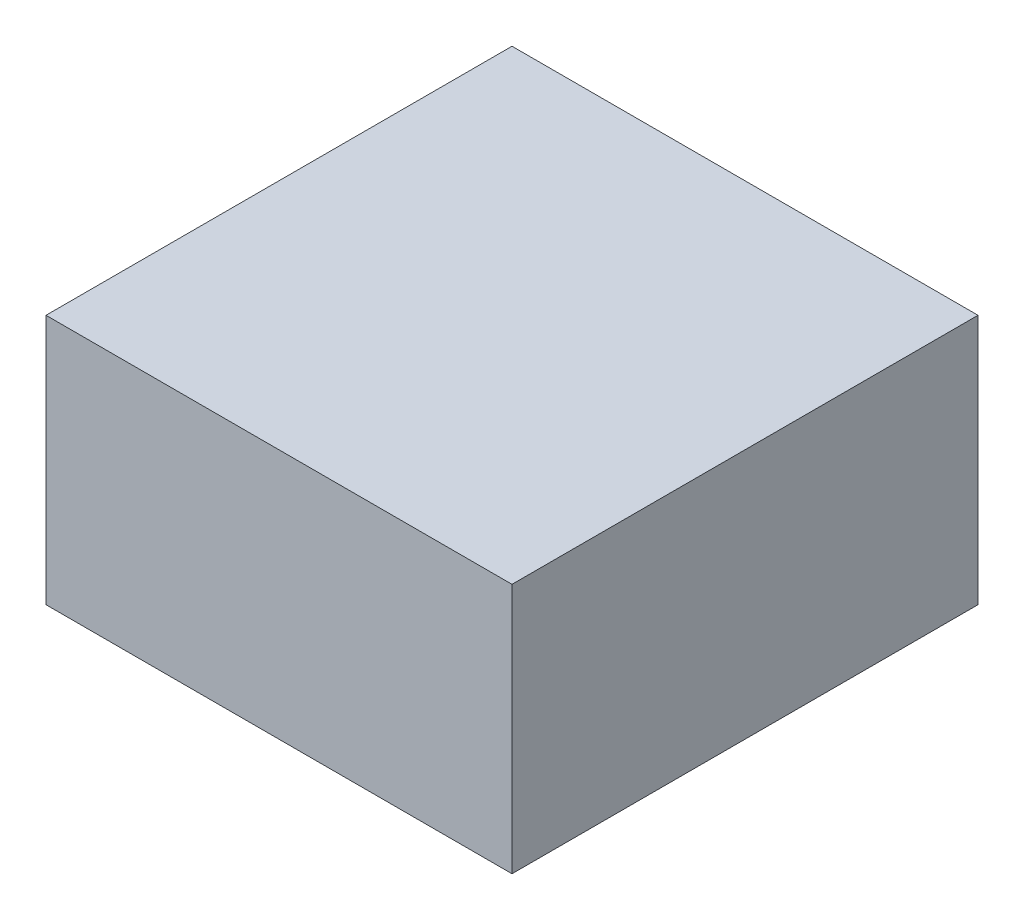
ISO-10303-21;
HEADER;
FILE_DESCRIPTION(('STEP AP214'),'2;1');
FILE_NAME('part.step','',(''),(''),'','','');
FILE_SCHEMA(('AUTOMOTIVE_DESIGN { 1 0 10303 214 1 1 1 1 }'));
ENDSEC;
DATA;
#1=APPLICATION_CONTEXT('core data for automotive mechanical design processes');
#2=APPLICATION_PROTOCOL_DEFINITION('international standard','automotive_design',2000,#1);
#3=PRODUCT_CONTEXT('',#1,'mechanical');
#4=PRODUCT('Part','Part','',(#3));
#5=PRODUCT_RELATED_PRODUCT_CATEGORY('part','',(#4));
#6=PRODUCT_DEFINITION_FORMATION('','',#4);
#7=PRODUCT_DEFINITION_CONTEXT('part definition',#1,'design');
#8=PRODUCT_DEFINITION('design','',#6,#7);
#9=PRODUCT_DEFINITION_SHAPE('','',#8);
#10=(LENGTH_UNIT() NAMED_UNIT(*) SI_UNIT(.MILLI.,.METRE.));
#11=(NAMED_UNIT(*) PLANE_ANGLE_UNIT() SI_UNIT($,.RADIAN.));
#12=(NAMED_UNIT(*) SI_UNIT($,.STERADIAN.) SOLID_ANGLE_UNIT());
#13=UNCERTAINTY_MEASURE_WITH_UNIT(LENGTH_MEASURE(1.E-05),#10,'distance_accuracy_value','');
#14=(GEOMETRIC_REPRESENTATION_CONTEXT(3) GLOBAL_UNCERTAINTY_ASSIGNED_CONTEXT((#13)) GLOBAL_UNIT_ASSIGNED_CONTEXT((#10,
#11,#12)) REPRESENTATION_CONTEXT('',''));
#15=CARTESIAN_POINT('',(0.,0.,0.));
#16=DIRECTION('',(0.,0.,1.));
#17=DIRECTION('',(1.,0.,0.));
#18=AXIS2_PLACEMENT_3D('',#15,#16,#17);
#19=CARTESIAN_POINT('',(72.5,78.,72.5));
#20=DIRECTION('',(-1.,0.,0.));
#21=DIRECTION('',(0.,0.,1.));
#22=AXIS2_PLACEMENT_3D('',#19,#20,#21);
#23=PLANE('',#22);
#24=DIRECTION('',(0.,0.,-1.));
#25=VECTOR('',#24,1.);
#26=CARTESIAN_POINT('',(72.5,0.,72.5));
#27=LINE('',#26,#25);
#28=CARTESIAN_POINT('',(72.5,0.,72.5));
#29=VERTEX_POINT('',#28);
#30=CARTESIAN_POINT('',(72.5,0.,-72.5));
#31=VERTEX_POINT('',#30);
#32=EDGE_CURVE('E105',#29,#31,#27,.T.);
#33=ORIENTED_EDGE('',*,*,#32,.T.);
#34=DIRECTION('',(0.,-1.,0.));
#35=VECTOR('',#34,1.);
#36=CARTESIAN_POINT('',(72.5,78.,-72.5));
#37=LINE('',#36,#35);
#38=CARTESIAN_POINT('',(72.5,78.,-72.5));
#39=VERTEX_POINT('',#38);
#40=EDGE_CURVE('E11',#39,#31,#37,.T.);
#41=ORIENTED_EDGE('',*,*,#40,.F.);
#42=DIRECTION('',(0.,0.,-1.));
#43=VECTOR('',#42,1.);
#44=CARTESIAN_POINT('',(72.5,78.,72.5));
#45=LINE('',#44,#43);
#46=CARTESIAN_POINT('',(72.5,78.,72.5));
#47=VERTEX_POINT('',#46);
#48=EDGE_CURVE('E88',#47,#39,#45,.T.);
#49=ORIENTED_EDGE('',*,*,#48,.F.);
#50=DIRECTION('',(0.,-1.,0.));
#51=VECTOR('',#50,1.);
#52=CARTESIAN_POINT('',(72.5,78.,72.5));
#53=LINE('',#52,#51);
#54=EDGE_CURVE('E101',#47,#29,#53,.T.);
#55=ORIENTED_EDGE('',*,*,#54,.T.);
#56=EDGE_LOOP('',(#33,#41,#49,#55));
#57=FACE_BOUND('',#56,.T.);
#58=ADVANCED_FACE('F36',(#57),#23,.F.);
#59=CARTESIAN_POINT('',(-72.5,78.,-72.5));
#60=DIRECTION('',(0.,0.,1.));
#61=DIRECTION('',(1.,0.,0.));
#62=AXIS2_PLACEMENT_3D('',#59,#60,#61);
#63=PLANE('',#62);
#64=DIRECTION('',(-1.,0.,0.));
#65=VECTOR('',#64,1.);
#66=CARTESIAN_POINT('',(-72.5,0.,-72.5));
#67=LINE('',#66,#65);
#68=CARTESIAN_POINT('',(-72.5,0.,-72.5));
#69=VERTEX_POINT('',#68);
#70=EDGE_CURVE('E93',#31,#69,#67,.T.);
#71=ORIENTED_EDGE('',*,*,#70,.T.);
#72=DIRECTION('',(0.,-1.,0.));
#73=VECTOR('',#72,1.);
#74=CARTESIAN_POINT('',(-72.5,78.,-72.5));
#75=LINE('',#74,#73);
#76=CARTESIAN_POINT('',(-72.5,78.,-72.5));
#77=VERTEX_POINT('',#76);
#78=EDGE_CURVE('E45',#77,#69,#75,.T.);
#79=ORIENTED_EDGE('',*,*,#78,.F.);
#80=DIRECTION('',(-1.,0.,0.));
#81=VECTOR('',#80,1.);
#82=CARTESIAN_POINT('',(-72.5,78.,-72.5));
#83=LINE('',#82,#81);
#84=EDGE_CURVE('E83',#39,#77,#83,.T.);
#85=ORIENTED_EDGE('',*,*,#84,.F.);
#86=ORIENTED_EDGE('',*,*,#40,.T.);
#87=EDGE_LOOP('',(#71,#79,#85,#86));
#88=FACE_BOUND('',#87,.T.);
#89=ADVANCED_FACE('F92',(#88),#63,.F.);
#90=CARTESIAN_POINT('',(-72.5,78.,72.5));
#91=DIRECTION('',(1.,0.,0.));
#92=DIRECTION('',(0.,0.,-1.));
#93=AXIS2_PLACEMENT_3D('',#90,#91,#92);
#94=PLANE('',#93);
#95=DIRECTION('',(0.,0.,1.));
#96=VECTOR('',#95,1.);
#97=CARTESIAN_POINT('',(-72.5,0.,72.5));
#98=LINE('',#97,#96);
#99=CARTESIAN_POINT('',(-72.5,0.,72.5));
#100=VERTEX_POINT('',#99);
#101=EDGE_CURVE('E70',#69,#100,#98,.T.);
#102=ORIENTED_EDGE('',*,*,#101,.T.);
#103=DIRECTION('',(0.,-1.,0.));
#104=VECTOR('',#103,1.);
#105=CARTESIAN_POINT('',(-72.5,78.,72.5));
#106=LINE('',#105,#104);
#107=CARTESIAN_POINT('',(-72.5,78.,72.5));
#108=VERTEX_POINT('',#107);
#109=EDGE_CURVE('E95',#108,#100,#106,.T.);
#110=ORIENTED_EDGE('',*,*,#109,.F.);
#111=DIRECTION('',(0.,0.,1.));
#112=VECTOR('',#111,1.);
#113=CARTESIAN_POINT('',(-72.5,78.,72.5));
#114=LINE('',#113,#112);
#115=EDGE_CURVE('E86',#77,#108,#114,.T.);
#116=ORIENTED_EDGE('',*,*,#115,.F.);
#117=ORIENTED_EDGE('',*,*,#78,.T.);
#118=EDGE_LOOP('',(#102,#110,#116,#117));
#119=FACE_BOUND('',#118,.T.);
#120=ADVANCED_FACE('F96',(#119),#94,.F.);
#121=CARTESIAN_POINT('',(-72.5,78.,72.5));
#122=DIRECTION('',(0.,0.,-1.));
#123=DIRECTION('',(-1.,0.,0.));
#124=AXIS2_PLACEMENT_3D('',#121,#122,#123);
#125=PLANE('',#124);
#126=DIRECTION('',(1.,0.,0.));
#127=VECTOR('',#126,1.);
#128=CARTESIAN_POINT('',(-72.5,0.,72.5));
#129=LINE('',#128,#127);
#130=EDGE_CURVE('E76',#100,#29,#129,.T.);
#131=ORIENTED_EDGE('',*,*,#130,.T.);
#132=ORIENTED_EDGE('',*,*,#54,.F.);
#133=DIRECTION('',(1.,0.,0.));
#134=VECTOR('',#133,1.);
#135=CARTESIAN_POINT('',(-72.5,78.,72.5));
#136=LINE('',#135,#134);
#137=EDGE_CURVE('E53',#108,#47,#136,.T.);
#138=ORIENTED_EDGE('',*,*,#137,.F.);
#139=ORIENTED_EDGE('',*,*,#109,.T.);
#140=EDGE_LOOP('',(#131,#132,#138,#139));
#141=FACE_BOUND('',#140,.T.);
#142=ADVANCED_FACE('F118',(#141),#125,.F.);
#143=CARTESIAN_POINT('',(0.,78.,0.));
#144=DIRECTION('',(0.,-1.,0.));
#145=DIRECTION('',(0.,0.,-1.));
#146=AXIS2_PLACEMENT_3D('',#143,#144,#145);
#147=PLANE('',#146);
#148=ORIENTED_EDGE('',*,*,#48,.T.);
#149=ORIENTED_EDGE('',*,*,#84,.T.);
#150=ORIENTED_EDGE('',*,*,#115,.T.);
#151=ORIENTED_EDGE('',*,*,#137,.T.);
#152=EDGE_LOOP('',(#148,#149,#150,#151));
#153=FACE_BOUND('',#152,.T.);
#154=ADVANCED_FACE('F84',(#153),#147,.F.);
#155=CARTESIAN_POINT('',(0.,0.,0.));
#156=DIRECTION('',(0.,-1.,0.));
#157=DIRECTION('',(0.,0.,-1.));
#158=AXIS2_PLACEMENT_3D('',#155,#156,#157);
#159=PLANE('',#158);
#160=ORIENTED_EDGE('',*,*,#32,.F.);
#161=ORIENTED_EDGE('',*,*,#130,.F.);
#162=ORIENTED_EDGE('',*,*,#101,.F.);
#163=ORIENTED_EDGE('',*,*,#70,.F.);
#164=EDGE_LOOP('',(#160,#161,#162,#163));
#165=FACE_BOUND('',#164,.T.);
#166=ADVANCED_FACE('F121',(#165),#159,.T.);
#167=CLOSED_SHELL('',(#58,#89,#120,#142,#154,#166));
#168=MANIFOLD_SOLID_BREP('B2',#167);
#169=ADVANCED_BREP_SHAPE_REPRESENTATION('',(#18,#168),#14);
#170=SHAPE_DEFINITION_REPRESENTATION(#9,#169);
ENDSEC;
END-ISO-10303-21;
